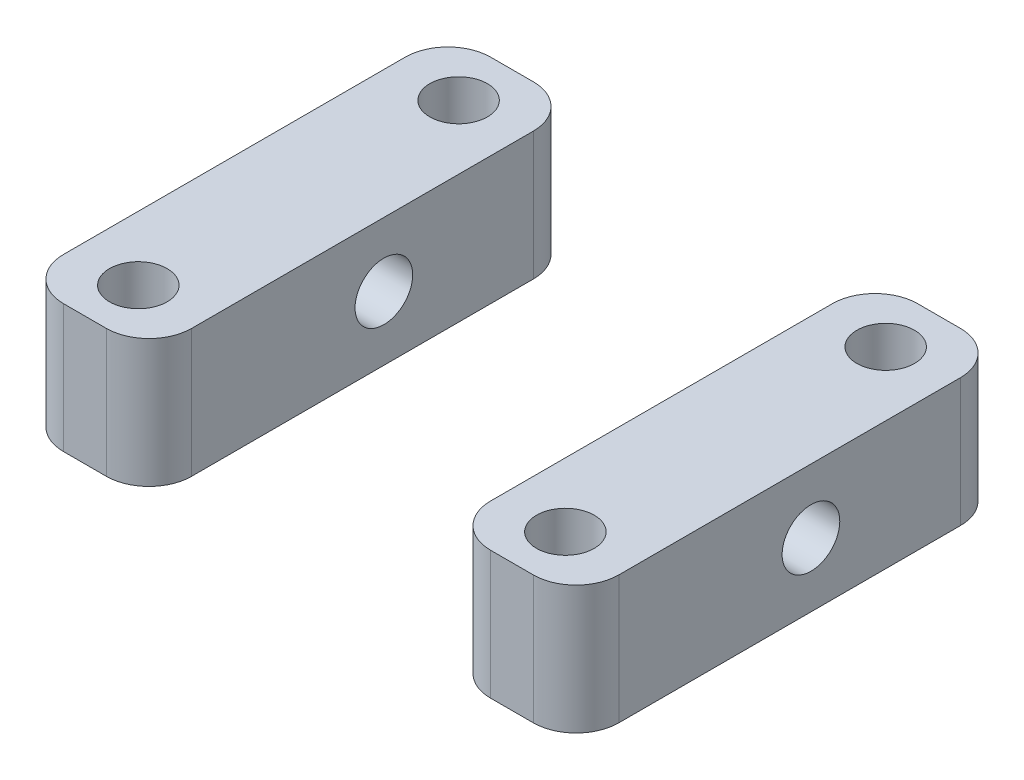
ISO-10303-21;
HEADER;
FILE_DESCRIPTION(('STEP AP214'),'2;1');
FILE_NAME('part.step','',(''),(''),'','','');
FILE_SCHEMA(('AUTOMOTIVE_DESIGN { 1 0 10303 214 1 1 1 1 }'));
ENDSEC;
DATA;
#1=APPLICATION_CONTEXT('core data for automotive mechanical design processes');
#2=APPLICATION_PROTOCOL_DEFINITION('international standard','automotive_design',2000,#1);
#3=PRODUCT_CONTEXT('',#1,'mechanical');
#4=PRODUCT('Part','Part','',(#3));
#5=PRODUCT_RELATED_PRODUCT_CATEGORY('part','',(#4));
#6=PRODUCT_DEFINITION_FORMATION('','',#4);
#7=PRODUCT_DEFINITION_CONTEXT('part definition',#1,'design');
#8=PRODUCT_DEFINITION('design','',#6,#7);
#9=PRODUCT_DEFINITION_SHAPE('','',#8);
#10=(LENGTH_UNIT() NAMED_UNIT(*) SI_UNIT(.MILLI.,.METRE.));
#11=(NAMED_UNIT(*) PLANE_ANGLE_UNIT() SI_UNIT($,.RADIAN.));
#12=(NAMED_UNIT(*) SI_UNIT($,.STERADIAN.) SOLID_ANGLE_UNIT());
#13=UNCERTAINTY_MEASURE_WITH_UNIT(LENGTH_MEASURE(1.E-05),#10,'distance_accuracy_value','');
#14=(GEOMETRIC_REPRESENTATION_CONTEXT(3) GLOBAL_UNCERTAINTY_ASSIGNED_CONTEXT((#13)) GLOBAL_UNIT_ASSIGNED_CONTEXT((#10,
#11,#12)) REPRESENTATION_CONTEXT('',''));
#15=CARTESIAN_POINT('',(0.,0.,0.));
#16=DIRECTION('',(0.,0.,1.));
#17=DIRECTION('',(1.,0.,0.));
#18=AXIS2_PLACEMENT_3D('',#15,#16,#17);
#19=CARTESIAN_POINT('',(0.,6.,0.));
#20=DIRECTION('',(0.,-1.,0.));
#21=DIRECTION('',(0.,0.,-1.));
#22=AXIS2_PLACEMENT_3D('',#19,#20,#21);
#23=PLANE('',#22);
#24=CARTESIAN_POINT('',(-10.,6.,7.5));
#25=DIRECTION('',(0.,1.,0.));
#26=DIRECTION('',(0.,0.,-1.));
#27=AXIS2_PLACEMENT_3D('',#24,#25,#26);
#28=CIRCLE('',#27,1.35);
#29=CARTESIAN_POINT('',(-10.,6.,6.15));
#30=VERTEX_POINT('',#29);
#31=EDGE_CURVE('E143',#30,#30,#28,.T.);
#32=ORIENTED_EDGE('',*,*,#31,.F.);
#33=EDGE_LOOP('',(#32));
#34=FACE_BOUND('',#33,.T.);
#35=CARTESIAN_POINT('',(-10.,6.,-7.5));
#36=DIRECTION('',(0.,1.,0.));
#37=DIRECTION('',(0.,0.,1.));
#38=AXIS2_PLACEMENT_3D('',#35,#36,#37);
#39=CIRCLE('',#38,1.35);
#40=CARTESIAN_POINT('',(-10.,6.,-6.15));
#41=VERTEX_POINT('',#40);
#42=EDGE_CURVE('E139',#41,#41,#39,.T.);
#43=ORIENTED_EDGE('',*,*,#42,.F.);
#44=EDGE_LOOP('',(#43));
#45=FACE_BOUND('',#44,.T.);
#46=DIRECTION('',(-1.,0.,0.));
#47=VECTOR('',#46,1.);
#48=CARTESIAN_POINT('',(-13.,6.,-10.));
#49=LINE('',#48,#47);
#50=CARTESIAN_POINT('',(-9.,6.,-10.));
#51=VERTEX_POINT('',#50);
#52=CARTESIAN_POINT('',(-11.,6.,-10.));
#53=VERTEX_POINT('',#52);
#54=EDGE_CURVE('E153',#51,#53,#49,.T.);
#55=ORIENTED_EDGE('',*,*,#54,.T.);
#56=CARTESIAN_POINT('',(-11.,6.,-8.));
#57=DIRECTION('',(0.,-1.,0.));
#58=DIRECTION('',(0.,0.,-1.));
#59=AXIS2_PLACEMENT_3D('',#56,#57,#58);
#60=CIRCLE('',#59,2.);
#61=CARTESIAN_POINT('',(-13.,6.,-8.));
#62=VERTEX_POINT('',#61);
#63=EDGE_CURVE('E185',#53,#62,#60,.F.);
#64=ORIENTED_EDGE('',*,*,#63,.T.);
#65=DIRECTION('',(0.,0.,1.));
#66=VECTOR('',#65,1.);
#67=CARTESIAN_POINT('',(-13.,6.,10.));
#68=LINE('',#67,#66);
#69=CARTESIAN_POINT('',(-13.,6.,8.));
#70=VERTEX_POINT('',#69);
#71=EDGE_CURVE('E132',#62,#70,#68,.T.);
#72=ORIENTED_EDGE('',*,*,#71,.T.);
#73=CARTESIAN_POINT('',(-11.,6.,8.));
#74=DIRECTION('',(0.,-1.,0.));
#75=DIRECTION('',(0.,0.,-1.));
#76=AXIS2_PLACEMENT_3D('',#73,#74,#75);
#77=CIRCLE('',#76,2.);
#78=CARTESIAN_POINT('',(-11.,6.,10.));
#79=VERTEX_POINT('',#78);
#80=EDGE_CURVE('E181',#70,#79,#77,.F.);
#81=ORIENTED_EDGE('',*,*,#80,.T.);
#82=DIRECTION('',(1.,0.,0.));
#83=VECTOR('',#82,1.);
#84=CARTESIAN_POINT('',(-13.,6.,10.));
#85=LINE('',#84,#83);
#86=CARTESIAN_POINT('',(-9.,6.,10.));
#87=VERTEX_POINT('',#86);
#88=EDGE_CURVE('E166',#79,#87,#85,.T.);
#89=ORIENTED_EDGE('',*,*,#88,.T.);
#90=CARTESIAN_POINT('',(-9.,6.,8.));
#91=DIRECTION('',(0.,-1.,0.));
#92=DIRECTION('',(0.,0.,-1.));
#93=AXIS2_PLACEMENT_3D('',#90,#91,#92);
#94=CIRCLE('',#93,2.);
#95=CARTESIAN_POINT('',(-7.,6.,8.));
#96=VERTEX_POINT('',#95);
#97=EDGE_CURVE('E60',#87,#96,#94,.F.);
#98=ORIENTED_EDGE('',*,*,#97,.T.);
#99=DIRECTION('',(0.,0.,1.));
#100=VECTOR('',#99,1.);
#101=CARTESIAN_POINT('',(-7.,6.,-10.));
#102=LINE('',#101,#100);
#103=CARTESIAN_POINT('',(-7.,6.,-8.));
#104=VERTEX_POINT('',#103);
#105=EDGE_CURVE('E162',#104,#96,#102,.T.);
#106=ORIENTED_EDGE('',*,*,#105,.F.);
#107=CARTESIAN_POINT('',(-9.,6.,-8.));
#108=DIRECTION('',(0.,-1.,0.));
#109=DIRECTION('',(0.,0.,-1.));
#110=AXIS2_PLACEMENT_3D('',#107,#108,#109);
#111=CIRCLE('',#110,2.);
#112=EDGE_CURVE('E68',#104,#51,#111,.F.);
#113=ORIENTED_EDGE('',*,*,#112,.T.);
#114=EDGE_LOOP('',(#55,#64,#72,#81,#89,#98,#106,#113));
#115=FACE_BOUND('',#114,.T.);
#116=ADVANCED_FACE('F45',(#34,#45,#115),#23,.F.);
#117=CARTESIAN_POINT('',(0.,0.,0.));
#118=DIRECTION('',(0.,-1.,0.));
#119=DIRECTION('',(0.,0.,-1.));
#120=AXIS2_PLACEMENT_3D('',#117,#118,#119);
#121=PLANE('',#120);
#122=DIRECTION('',(0.,0.,1.));
#123=VECTOR('',#122,1.);
#124=CARTESIAN_POINT('',(-13.,0.,10.));
#125=LINE('',#124,#123);
#126=CARTESIAN_POINT('',(-13.,0.,-8.));
#127=VERTEX_POINT('',#126);
#128=CARTESIAN_POINT('',(-13.,0.,8.));
#129=VERTEX_POINT('',#128);
#130=EDGE_CURVE('E129',#127,#129,#125,.T.);
#131=ORIENTED_EDGE('',*,*,#130,.F.);
#132=CARTESIAN_POINT('',(-11.,0.,-8.));
#133=DIRECTION('',(0.,-1.,0.));
#134=DIRECTION('',(0.,0.,-1.));
#135=AXIS2_PLACEMENT_3D('',#132,#133,#134);
#136=CIRCLE('',#135,2.);
#137=CARTESIAN_POINT('',(-11.,0.,-10.));
#138=VERTEX_POINT('',#137);
#139=EDGE_CURVE('E112',#127,#138,#136,.T.);
#140=ORIENTED_EDGE('',*,*,#139,.T.);
#141=DIRECTION('',(-1.,0.,0.));
#142=VECTOR('',#141,1.);
#143=CARTESIAN_POINT('',(-13.,0.,-10.));
#144=LINE('',#143,#142);
#145=CARTESIAN_POINT('',(-9.,0.,-10.));
#146=VERTEX_POINT('',#145);
#147=EDGE_CURVE('E146',#146,#138,#144,.T.);
#148=ORIENTED_EDGE('',*,*,#147,.F.);
#149=CARTESIAN_POINT('',(-9.,0.,-8.));
#150=DIRECTION('',(0.,-1.,0.));
#151=DIRECTION('',(0.,0.,-1.));
#152=AXIS2_PLACEMENT_3D('',#149,#150,#151);
#153=CIRCLE('',#152,2.);
#154=CARTESIAN_POINT('',(-7.,0.,-8.));
#155=VERTEX_POINT('',#154);
#156=EDGE_CURVE('E123',#146,#155,#153,.T.);
#157=ORIENTED_EDGE('',*,*,#156,.T.);
#158=DIRECTION('',(0.,0.,1.));
#159=VECTOR('',#158,1.);
#160=CARTESIAN_POINT('',(-7.,0.,-10.));
#161=LINE('',#160,#159);
#162=CARTESIAN_POINT('',(-7.,0.,8.));
#163=VERTEX_POINT('',#162);
#164=EDGE_CURVE('E152',#155,#163,#161,.T.);
#165=ORIENTED_EDGE('',*,*,#164,.T.);
#166=CARTESIAN_POINT('',(-9.,0.,8.));
#167=DIRECTION('',(0.,-1.,0.));
#168=DIRECTION('',(0.,0.,-1.));
#169=AXIS2_PLACEMENT_3D('',#166,#167,#168);
#170=CIRCLE('',#169,2.);
#171=CARTESIAN_POINT('',(-9.,0.,10.));
#172=VERTEX_POINT('',#171);
#173=EDGE_CURVE('E176',#163,#172,#170,.T.);
#174=ORIENTED_EDGE('',*,*,#173,.T.);
#175=DIRECTION('',(1.,0.,0.));
#176=VECTOR('',#175,1.);
#177=CARTESIAN_POINT('',(-13.,0.,10.));
#178=LINE('',#177,#176);
#179=CARTESIAN_POINT('',(-11.,0.,10.));
#180=VERTEX_POINT('',#179);
#181=EDGE_CURVE('E140',#180,#172,#178,.T.);
#182=ORIENTED_EDGE('',*,*,#181,.F.);
#183=CARTESIAN_POINT('',(-11.,0.,8.));
#184=DIRECTION('',(0.,-1.,0.));
#185=DIRECTION('',(0.,0.,-1.));
#186=AXIS2_PLACEMENT_3D('',#183,#184,#185);
#187=CIRCLE('',#186,2.);
#188=EDGE_CURVE('E133',#180,#129,#187,.T.);
#189=ORIENTED_EDGE('',*,*,#188,.T.);
#190=EDGE_LOOP('',(#131,#140,#148,#157,#165,#174,#182,#189));
#191=FACE_BOUND('',#190,.T.);
#192=CARTESIAN_POINT('',(-10.,0.,7.5));
#193=DIRECTION('',(0.,1.,0.));
#194=DIRECTION('',(0.,0.,-1.));
#195=AXIS2_PLACEMENT_3D('',#192,#193,#194);
#196=CIRCLE('',#195,1.35);
#197=CARTESIAN_POINT('',(-10.,0.,6.15));
#198=VERTEX_POINT('',#197);
#199=EDGE_CURVE('E156',#198,#198,#196,.T.);
#200=ORIENTED_EDGE('',*,*,#199,.T.);
#201=EDGE_LOOP('',(#200));
#202=FACE_BOUND('',#201,.T.);
#203=CARTESIAN_POINT('',(-10.,0.,-7.5));
#204=DIRECTION('',(0.,1.,0.));
#205=DIRECTION('',(0.,0.,1.));
#206=AXIS2_PLACEMENT_3D('',#203,#204,#205);
#207=CIRCLE('',#206,1.35);
#208=CARTESIAN_POINT('',(-10.,0.,-6.15));
#209=VERTEX_POINT('',#208);
#210=EDGE_CURVE('E154',#209,#209,#207,.T.);
#211=ORIENTED_EDGE('',*,*,#210,.T.);
#212=EDGE_LOOP('',(#211));
#213=FACE_BOUND('',#212,.T.);
#214=ADVANCED_FACE('F136',(#191,#202,#213),#121,.T.);
#215=CARTESIAN_POINT('',(-13.,6.,-10.));
#216=DIRECTION('',(0.,0.,1.));
#217=DIRECTION('',(1.,0.,0.));
#218=AXIS2_PLACEMENT_3D('',#215,#216,#217);
#219=PLANE('',#218);
#220=ORIENTED_EDGE('',*,*,#147,.T.);
#221=DIRECTION('',(0.,-1.,0.));
#222=VECTOR('',#221,1.);
#223=CARTESIAN_POINT('',(-11.,6.,-10.));
#224=LINE('',#223,#222);
#225=EDGE_CURVE('E117',#138,#53,#224,.F.);
#226=ORIENTED_EDGE('',*,*,#225,.T.);
#227=ORIENTED_EDGE('',*,*,#54,.F.);
#228=DIRECTION('',(0.,1.,0.));
#229=VECTOR('',#228,1.);
#230=CARTESIAN_POINT('',(-9.,6.,-10.));
#231=LINE('',#230,#229);
#232=EDGE_CURVE('E122',#51,#146,#231,.F.);
#233=ORIENTED_EDGE('',*,*,#232,.T.);
#234=EDGE_LOOP('',(#220,#226,#227,#233));
#235=FACE_BOUND('',#234,.T.);
#236=ADVANCED_FACE('F214',(#235),#219,.F.);
#237=CARTESIAN_POINT('',(-13.,6.,10.));
#238=DIRECTION('',(0.,0.,-1.));
#239=DIRECTION('',(-1.,0.,0.));
#240=AXIS2_PLACEMENT_3D('',#237,#238,#239);
#241=PLANE('',#240);
#242=ORIENTED_EDGE('',*,*,#181,.T.);
#243=DIRECTION('',(0.,1.,0.));
#244=VECTOR('',#243,1.);
#245=CARTESIAN_POINT('',(-9.,6.,10.));
#246=LINE('',#245,#244);
#247=EDGE_CURVE('E12',#172,#87,#246,.T.);
#248=ORIENTED_EDGE('',*,*,#247,.T.);
#249=ORIENTED_EDGE('',*,*,#88,.F.);
#250=DIRECTION('',(0.,-1.,0.));
#251=VECTOR('',#250,1.);
#252=CARTESIAN_POINT('',(-11.,6.,10.));
#253=LINE('',#252,#251);
#254=EDGE_CURVE('E53',#79,#180,#253,.T.);
#255=ORIENTED_EDGE('',*,*,#254,.T.);
#256=EDGE_LOOP('',(#242,#248,#249,#255));
#257=FACE_BOUND('',#256,.T.);
#258=ADVANCED_FACE('F194',(#257),#241,.F.);
#259=CARTESIAN_POINT('',(-13.,6.,10.));
#260=DIRECTION('',(1.,0.,0.));
#261=DIRECTION('',(0.,0.,-1.));
#262=AXIS2_PLACEMENT_3D('',#259,#260,#261);
#263=PLANE('',#262);
#264=CARTESIAN_POINT('',(-13.,3.,-1.));
#265=DIRECTION('',(1.,0.,0.));
#266=DIRECTION('',(0.,0.,-1.));
#267=AXIS2_PLACEMENT_3D('',#264,#265,#266);
#268=CIRCLE('',#267,1.35);
#269=CARTESIAN_POINT('',(-13.,3.,-2.35));
#270=VERTEX_POINT('',#269);
#271=EDGE_CURVE('E150',#270,#270,#268,.T.);
#272=ORIENTED_EDGE('',*,*,#271,.T.);
#273=EDGE_LOOP('',(#272));
#274=FACE_BOUND('',#273,.T.);
#275=ORIENTED_EDGE('',*,*,#71,.F.);
#276=DIRECTION('',(0.,-1.,0.));
#277=VECTOR('',#276,1.);
#278=CARTESIAN_POINT('',(-13.,6.,-8.));
#279=LINE('',#278,#277);
#280=EDGE_CURVE('E116',#62,#127,#279,.T.);
#281=ORIENTED_EDGE('',*,*,#280,.T.);
#282=ORIENTED_EDGE('',*,*,#130,.T.);
#283=DIRECTION('',(0.,-1.,0.));
#284=VECTOR('',#283,1.);
#285=CARTESIAN_POINT('',(-13.,6.,8.));
#286=LINE('',#285,#284);
#287=EDGE_CURVE('E134',#129,#70,#286,.F.);
#288=ORIENTED_EDGE('',*,*,#287,.T.);
#289=EDGE_LOOP('',(#275,#281,#282,#288));
#290=FACE_BOUND('',#289,.T.);
#291=ADVANCED_FACE('F128',(#274,#290),#263,.F.);
#292=CARTESIAN_POINT('',(-10.,6.,-7.5));
#293=DIRECTION('',(0.,-1.,0.));
#294=DIRECTION('',(0.,0.,-1.));
#295=AXIS2_PLACEMENT_3D('',#292,#293,#294);
#296=CYLINDRICAL_SURFACE('',#295,1.35);
#297=ORIENTED_EDGE('',*,*,#42,.T.);
#298=EDGE_LOOP('',(#297));
#299=FACE_BOUND('',#298,.T.);
#300=ORIENTED_EDGE('',*,*,#210,.F.);
#301=EDGE_LOOP('',(#300));
#302=FACE_BOUND('',#301,.T.);
#303=ADVANCED_FACE('F243',(#299,#302),#296,.F.);
#304=CARTESIAN_POINT('',(-10.,6.,7.5));
#305=DIRECTION('',(0.,-1.,0.));
#306=DIRECTION('',(0.,0.,-1.));
#307=AXIS2_PLACEMENT_3D('',#304,#305,#306);
#308=CYLINDRICAL_SURFACE('',#307,1.35);
#309=ORIENTED_EDGE('',*,*,#31,.T.);
#310=EDGE_LOOP('',(#309));
#311=FACE_BOUND('',#310,.T.);
#312=ORIENTED_EDGE('',*,*,#199,.F.);
#313=EDGE_LOOP('',(#312));
#314=FACE_BOUND('',#313,.T.);
#315=ADVANCED_FACE('F239',(#311,#314),#308,.F.);
#316=CARTESIAN_POINT('',(-7.,0.,-10.));
#317=DIRECTION('',(-1.,0.,0.));
#318=DIRECTION('',(0.,0.,1.));
#319=AXIS2_PLACEMENT_3D('',#316,#317,#318);
#320=PLANE('',#319);
#321=CARTESIAN_POINT('',(-7.,3.,-1.));
#322=DIRECTION('',(-1.,0.,0.));
#323=DIRECTION('',(0.,0.,1.));
#324=AXIS2_PLACEMENT_3D('',#321,#322,#323);
#325=CIRCLE('',#324,1.35);
#326=CARTESIAN_POINT('',(-7.,3.,0.35));
#327=VERTEX_POINT('',#326);
#328=EDGE_CURVE('E168',#327,#327,#325,.T.);
#329=ORIENTED_EDGE('',*,*,#328,.T.);
#330=EDGE_LOOP('',(#329));
#331=FACE_BOUND('',#330,.T.);
#332=ORIENTED_EDGE('',*,*,#164,.F.);
#333=DIRECTION('',(0.,1.,0.));
#334=VECTOR('',#333,1.);
#335=CARTESIAN_POINT('',(-7.,0.,-8.));
#336=LINE('',#335,#334);
#337=EDGE_CURVE('E189',#155,#104,#336,.T.);
#338=ORIENTED_EDGE('',*,*,#337,.T.);
#339=ORIENTED_EDGE('',*,*,#105,.T.);
#340=DIRECTION('',(0.,1.,0.));
#341=VECTOR('',#340,1.);
#342=CARTESIAN_POINT('',(-7.,0.,8.));
#343=LINE('',#342,#341);
#344=EDGE_CURVE('E187',#96,#163,#343,.F.);
#345=ORIENTED_EDGE('',*,*,#344,.T.);
#346=EDGE_LOOP('',(#332,#338,#339,#345));
#347=FACE_BOUND('',#346,.T.);
#348=ADVANCED_FACE('F228',(#331,#347),#320,.F.);
#349=CARTESIAN_POINT('',(-13.,3.,-1.));
#350=DIRECTION('',(1.,0.,0.));
#351=DIRECTION('',(0.,0.,-1.));
#352=AXIS2_PLACEMENT_3D('',#349,#350,#351);
#353=CYLINDRICAL_SURFACE('',#352,1.35);
#354=ORIENTED_EDGE('',*,*,#271,.F.);
#355=EDGE_LOOP('',(#354));
#356=FACE_BOUND('',#355,.T.);
#357=ORIENTED_EDGE('',*,*,#328,.F.);
#358=EDGE_LOOP('',(#357));
#359=FACE_BOUND('',#358,.T.);
#360=ADVANCED_FACE('F222',(#356,#359),#353,.F.);
#361=CARTESIAN_POINT('',(-11.,6.,-8.));
#362=DIRECTION('',(0.,-1.,0.));
#363=DIRECTION('',(0.,0.,-1.));
#364=AXIS2_PLACEMENT_3D('',#361,#362,#363);
#365=CYLINDRICAL_SURFACE('',#364,2.);
#366=ORIENTED_EDGE('',*,*,#63,.F.);
#367=ORIENTED_EDGE('',*,*,#225,.F.);
#368=ORIENTED_EDGE('',*,*,#139,.F.);
#369=ORIENTED_EDGE('',*,*,#280,.F.);
#370=EDGE_LOOP('',(#366,#367,#368,#369));
#371=FACE_BOUND('',#370,.T.);
#372=ADVANCED_FACE('F115',(#371),#365,.T.);
#373=CARTESIAN_POINT('',(-9.,0.,-8.));
#374=DIRECTION('',(0.,1.,0.));
#375=DIRECTION('',(0.,0.,1.));
#376=AXIS2_PLACEMENT_3D('',#373,#374,#375);
#377=CYLINDRICAL_SURFACE('',#376,2.);
#378=ORIENTED_EDGE('',*,*,#156,.F.);
#379=ORIENTED_EDGE('',*,*,#232,.F.);
#380=ORIENTED_EDGE('',*,*,#112,.F.);
#381=ORIENTED_EDGE('',*,*,#337,.F.);
#382=EDGE_LOOP('',(#378,#379,#380,#381));
#383=FACE_BOUND('',#382,.T.);
#384=ADVANCED_FACE('F207',(#383),#377,.T.);
#385=CARTESIAN_POINT('',(-9.,6.,8.));
#386=DIRECTION('',(0.,1.,0.));
#387=DIRECTION('',(0.,0.,1.));
#388=AXIS2_PLACEMENT_3D('',#385,#386,#387);
#389=CYLINDRICAL_SURFACE('',#388,2.);
#390=ORIENTED_EDGE('',*,*,#173,.F.);
#391=ORIENTED_EDGE('',*,*,#344,.F.);
#392=ORIENTED_EDGE('',*,*,#97,.F.);
#393=ORIENTED_EDGE('',*,*,#247,.F.);
#394=EDGE_LOOP('',(#390,#391,#392,#393));
#395=FACE_BOUND('',#394,.T.);
#396=ADVANCED_FACE('F202',(#395),#389,.T.);
#397=CARTESIAN_POINT('',(-11.,6.,8.));
#398=DIRECTION('',(0.,-1.,0.));
#399=DIRECTION('',(0.,0.,-1.));
#400=AXIS2_PLACEMENT_3D('',#397,#398,#399);
#401=CYLINDRICAL_SURFACE('',#400,2.);
#402=ORIENTED_EDGE('',*,*,#80,.F.);
#403=ORIENTED_EDGE('',*,*,#287,.F.);
#404=ORIENTED_EDGE('',*,*,#188,.F.);
#405=ORIENTED_EDGE('',*,*,#254,.F.);
#406=EDGE_LOOP('',(#402,#403,#404,#405));
#407=FACE_BOUND('',#406,.T.);
#408=ADVANCED_FACE('F47',(#407),#401,.T.);
#409=CLOSED_SHELL('',(#116,#214,#236,#258,#291,#303,#315,#348,#360,#372,#384,#396,#408));
#410=MANIFOLD_SOLID_BREP('B2',#409);
#411=CARTESIAN_POINT('',(10.,6.,-7.5));
#412=DIRECTION('',(0.,-1.,0.));
#413=DIRECTION('',(0.,0.,-1.));
#414=AXIS2_PLACEMENT_3D('',#411,#412,#413);
#415=CYLINDRICAL_SURFACE('',#414,1.35);
#416=CARTESIAN_POINT('',(10.,6.,-7.5));
#417=DIRECTION('',(0.,1.,0.));
#418=DIRECTION('',(0.,0.,-1.));
#419=AXIS2_PLACEMENT_3D('',#416,#417,#418);
#420=CIRCLE('',#419,1.35);
#421=CARTESIAN_POINT('',(10.,6.,-8.85));
#422=VERTEX_POINT('',#421);
#423=EDGE_CURVE('E430',#422,#422,#420,.T.);
#424=ORIENTED_EDGE('',*,*,#423,.T.);
#425=EDGE_LOOP('',(#424));
#426=FACE_BOUND('',#425,.T.);
#427=CARTESIAN_POINT('',(10.,0.,-7.5));
#428=DIRECTION('',(0.,1.,0.));
#429=DIRECTION('',(0.,0.,-1.));
#430=AXIS2_PLACEMENT_3D('',#427,#428,#429);
#431=CIRCLE('',#430,1.35);
#432=CARTESIAN_POINT('',(10.,0.,-8.85));
#433=VERTEX_POINT('',#432);
#434=EDGE_CURVE('E436',#433,#433,#431,.T.);
#435=ORIENTED_EDGE('',*,*,#434,.F.);
#436=EDGE_LOOP('',(#435));
#437=FACE_BOUND('',#436,.T.);
#438=ADVANCED_FACE('F336',(#426,#437),#415,.F.);
#439=CARTESIAN_POINT('',(10.,6.,7.5));
#440=DIRECTION('',(0.,-1.,0.));
#441=DIRECTION('',(0.,0.,-1.));
#442=AXIS2_PLACEMENT_3D('',#439,#440,#441);
#443=CYLINDRICAL_SURFACE('',#442,1.35);
#444=CARTESIAN_POINT('',(10.,6.,7.5));
#445=DIRECTION('',(0.,1.,0.));
#446=DIRECTION('',(0.,0.,1.));
#447=AXIS2_PLACEMENT_3D('',#444,#445,#446);
#448=CIRCLE('',#447,1.35);
#449=CARTESIAN_POINT('',(10.,6.,8.85));
#450=VERTEX_POINT('',#449);
#451=EDGE_CURVE('E482',#450,#450,#448,.T.);
#452=ORIENTED_EDGE('',*,*,#451,.T.);
#453=EDGE_LOOP('',(#452));
#454=FACE_BOUND('',#453,.T.);
#455=CARTESIAN_POINT('',(10.,0.,7.5));
#456=DIRECTION('',(0.,1.,0.));
#457=DIRECTION('',(0.,0.,1.));
#458=AXIS2_PLACEMENT_3D('',#455,#456,#457);
#459=CIRCLE('',#458,1.35);
#460=CARTESIAN_POINT('',(10.,0.,8.85));
#461=VERTEX_POINT('',#460);
#462=EDGE_CURVE('E478',#461,#461,#459,.T.);
#463=ORIENTED_EDGE('',*,*,#462,.F.);
#464=EDGE_LOOP('',(#463));
#465=FACE_BOUND('',#464,.T.);
#466=ADVANCED_FACE('F512',(#454,#465),#443,.F.);
#467=CARTESIAN_POINT('',(13.,6.,10.));
#468=DIRECTION('',(-1.,0.,0.));
#469=DIRECTION('',(0.,0.,1.));
#470=AXIS2_PLACEMENT_3D('',#467,#468,#469);
#471=PLANE('',#470);
#472=CARTESIAN_POINT('',(13.,3.,-1.));
#473=DIRECTION('',(1.,0.,0.));
#474=DIRECTION('',(0.,0.,-1.));
#475=AXIS2_PLACEMENT_3D('',#472,#473,#474);
#476=CIRCLE('',#475,1.35);
#477=CARTESIAN_POINT('',(13.,3.,-2.35));
#478=VERTEX_POINT('',#477);
#479=EDGE_CURVE('E447',#478,#478,#476,.T.);
#480=ORIENTED_EDGE('',*,*,#479,.F.);
#481=EDGE_LOOP('',(#480));
#482=FACE_BOUND('',#481,.T.);
#483=DIRECTION('',(0.,0.,-1.));
#484=VECTOR('',#483,1.);
#485=CARTESIAN_POINT('',(13.,6.,10.));
#486=LINE('',#485,#484);
#487=CARTESIAN_POINT('',(13.,6.,8.));
#488=VERTEX_POINT('',#487);
#489=CARTESIAN_POINT('',(13.,6.,-8.));
#490=VERTEX_POINT('',#489);
#491=EDGE_CURVE('E422',#488,#490,#486,.T.);
#492=ORIENTED_EDGE('',*,*,#491,.F.);
#493=DIRECTION('',(0.,-1.,0.));
#494=VECTOR('',#493,1.);
#495=CARTESIAN_POINT('',(13.,6.,8.));
#496=LINE('',#495,#494);
#497=CARTESIAN_POINT('',(13.,0.,8.));
#498=VERTEX_POINT('',#497);
#499=EDGE_CURVE('E406',#488,#498,#496,.T.);
#500=ORIENTED_EDGE('',*,*,#499,.T.);
#501=DIRECTION('',(0.,0.,-1.));
#502=VECTOR('',#501,1.);
#503=CARTESIAN_POINT('',(13.,0.,10.));
#504=LINE('',#503,#502);
#505=CARTESIAN_POINT('',(13.,0.,-8.));
#506=VERTEX_POINT('',#505);
#507=EDGE_CURVE('E419',#498,#506,#504,.T.);
#508=ORIENTED_EDGE('',*,*,#507,.T.);
#509=DIRECTION('',(0.,-1.,0.));
#510=VECTOR('',#509,1.);
#511=CARTESIAN_POINT('',(13.,6.,-8.));
#512=LINE('',#511,#510);
#513=EDGE_CURVE('E424',#506,#490,#512,.F.);
#514=ORIENTED_EDGE('',*,*,#513,.T.);
#515=EDGE_LOOP('',(#492,#500,#508,#514));
#516=FACE_BOUND('',#515,.T.);
#517=ADVANCED_FACE('F418',(#482,#516),#471,.F.);
#518=CARTESIAN_POINT('',(-13.,6.,10.));
#519=DIRECTION('',(0.,0.,-1.));
#520=DIRECTION('',(-1.,0.,0.));
#521=AXIS2_PLACEMENT_3D('',#518,#519,#520);
#522=PLANE('',#521);
#523=DIRECTION('',(1.,0.,0.));
#524=VECTOR('',#523,1.);
#525=CARTESIAN_POINT('',(-13.,0.,10.));
#526=LINE('',#525,#524);
#527=CARTESIAN_POINT('',(8.99999999999999,0.,10.));
#528=VERTEX_POINT('',#527);
#529=CARTESIAN_POINT('',(11.,0.,10.));
#530=VERTEX_POINT('',#529);
#531=EDGE_CURVE('E433',#528,#530,#526,.T.);
#532=ORIENTED_EDGE('',*,*,#531,.T.);
#533=DIRECTION('',(0.,-1.,0.));
#534=VECTOR('',#533,1.);
#535=CARTESIAN_POINT('',(11.,6.,10.));
#536=LINE('',#535,#534);
#537=CARTESIAN_POINT('',(11.,6.,10.));
#538=VERTEX_POINT('',#537);
#539=EDGE_CURVE('E407',#530,#538,#536,.F.);
#540=ORIENTED_EDGE('',*,*,#539,.T.);
#541=DIRECTION('',(1.,0.,0.));
#542=VECTOR('',#541,1.);
#543=CARTESIAN_POINT('',(-13.,6.,10.));
#544=LINE('',#543,#542);
#545=CARTESIAN_POINT('',(8.99999999999999,6.,10.));
#546=VERTEX_POINT('',#545);
#547=EDGE_CURVE('E439',#546,#538,#544,.T.);
#548=ORIENTED_EDGE('',*,*,#547,.F.);
#549=DIRECTION('',(0.,1.,0.));
#550=VECTOR('',#549,1.);
#551=CARTESIAN_POINT('',(9.,6.,10.));
#552=LINE('',#551,#550);
#553=EDGE_CURVE('E412',#546,#528,#552,.F.);
#554=ORIENTED_EDGE('',*,*,#553,.T.);
#555=EDGE_LOOP('',(#532,#540,#548,#554));
#556=FACE_BOUND('',#555,.T.);
#557=ADVANCED_FACE('F492',(#556),#522,.F.);
#558=CARTESIAN_POINT('',(-13.,6.,-10.));
#559=DIRECTION('',(0.,0.,1.));
#560=DIRECTION('',(1.,0.,0.));
#561=AXIS2_PLACEMENT_3D('',#558,#559,#560);
#562=PLANE('',#561);
#563=DIRECTION('',(-1.,0.,0.));
#564=VECTOR('',#563,1.);
#565=CARTESIAN_POINT('',(-13.,6.,-10.));
#566=LINE('',#565,#564);
#567=CARTESIAN_POINT('',(11.,6.,-10.));
#568=VERTEX_POINT('',#567);
#569=CARTESIAN_POINT('',(9.,6.,-10.));
#570=VERTEX_POINT('',#569);
#571=EDGE_CURVE('E489',#568,#570,#566,.T.);
#572=ORIENTED_EDGE('',*,*,#571,.F.);
#573=DIRECTION('',(0.,-1.,0.));
#574=VECTOR('',#573,1.);
#575=CARTESIAN_POINT('',(11.,6.,-10.));
#576=LINE('',#575,#574);
#577=CARTESIAN_POINT('',(11.,0.,-10.));
#578=VERTEX_POINT('',#577);
#579=EDGE_CURVE('E464',#568,#578,#576,.T.);
#580=ORIENTED_EDGE('',*,*,#579,.T.);
#581=DIRECTION('',(-1.,0.,0.));
#582=VECTOR('',#581,1.);
#583=CARTESIAN_POINT('',(-13.,0.,-10.));
#584=LINE('',#583,#582);
#585=CARTESIAN_POINT('',(9.,0.,-10.));
#586=VERTEX_POINT('',#585);
#587=EDGE_CURVE('E429',#578,#586,#584,.T.);
#588=ORIENTED_EDGE('',*,*,#587,.T.);
#589=DIRECTION('',(0.,1.,0.));
#590=VECTOR('',#589,1.);
#591=CARTESIAN_POINT('',(9.,6.,-10.));
#592=LINE('',#591,#590);
#593=EDGE_CURVE('E461',#586,#570,#592,.T.);
#594=ORIENTED_EDGE('',*,*,#593,.T.);
#595=EDGE_LOOP('',(#572,#580,#588,#594));
#596=FACE_BOUND('',#595,.T.);
#597=ADVANCED_FACE('F498',(#596),#562,.F.);
#598=CARTESIAN_POINT('',(0.,0.,0.));
#599=DIRECTION('',(0.,-1.,0.));
#600=DIRECTION('',(0.,0.,-1.));
#601=AXIS2_PLACEMENT_3D('',#598,#599,#600);
#602=PLANE('',#601);
#603=ORIENTED_EDGE('',*,*,#507,.F.);
#604=CARTESIAN_POINT('',(11.,0.,8.));
#605=DIRECTION('',(0.,-1.,0.));
#606=DIRECTION('',(0.,0.,-1.));
#607=AXIS2_PLACEMENT_3D('',#604,#605,#606);
#608=CIRCLE('',#607,2.);
#609=EDGE_CURVE('E402',#498,#530,#608,.T.);
#610=ORIENTED_EDGE('',*,*,#609,.T.);
#611=ORIENTED_EDGE('',*,*,#531,.F.);
#612=CARTESIAN_POINT('',(9.,0.,8.));
#613=DIRECTION('',(0.,-1.,0.));
#614=DIRECTION('',(0.,0.,-1.));
#615=AXIS2_PLACEMENT_3D('',#612,#613,#614);
#616=CIRCLE('',#615,2.);
#617=CARTESIAN_POINT('',(7.,0.,8.));
#618=VERTEX_POINT('',#617);
#619=EDGE_CURVE('E423',#528,#618,#616,.T.);
#620=ORIENTED_EDGE('',*,*,#619,.T.);
#621=DIRECTION('',(0.,0.,-1.));
#622=VECTOR('',#621,1.);
#623=CARTESIAN_POINT('',(7.,0.,-10.));
#624=LINE('',#623,#622);
#625=CARTESIAN_POINT('',(7.,0.,-8.));
#626=VERTEX_POINT('',#625);
#627=EDGE_CURVE('E471',#618,#626,#624,.T.);
#628=ORIENTED_EDGE('',*,*,#627,.T.);
#629=CARTESIAN_POINT('',(9.,0.,-8.));
#630=DIRECTION('',(0.,-1.,0.));
#631=DIRECTION('',(0.,0.,-1.));
#632=AXIS2_PLACEMENT_3D('',#629,#630,#631);
#633=CIRCLE('',#632,2.);
#634=EDGE_CURVE('E450',#626,#586,#633,.T.);
#635=ORIENTED_EDGE('',*,*,#634,.T.);
#636=ORIENTED_EDGE('',*,*,#587,.F.);
#637=CARTESIAN_POINT('',(11.,0.,-8.));
#638=DIRECTION('',(0.,-1.,0.));
#639=DIRECTION('',(0.,0.,-1.));
#640=AXIS2_PLACEMENT_3D('',#637,#638,#639);
#641=CIRCLE('',#640,2.);
#642=EDGE_CURVE('E413',#578,#506,#641,.T.);
#643=ORIENTED_EDGE('',*,*,#642,.T.);
#644=EDGE_LOOP('',(#603,#610,#611,#620,#628,#635,#636,#643));
#645=FACE_BOUND('',#644,.T.);
#646=ORIENTED_EDGE('',*,*,#462,.T.);
#647=EDGE_LOOP('',(#646));
#648=FACE_BOUND('',#647,.T.);
#649=ORIENTED_EDGE('',*,*,#434,.T.);
#650=EDGE_LOOP('',(#649));
#651=FACE_BOUND('',#650,.T.);
#652=ADVANCED_FACE('F426',(#645,#648,#651),#602,.T.);
#653=CARTESIAN_POINT('',(0.,6.,0.));
#654=DIRECTION('',(0.,-1.,0.));
#655=DIRECTION('',(0.,0.,-1.));
#656=AXIS2_PLACEMENT_3D('',#653,#654,#655);
#657=PLANE('',#656);
#658=ORIENTED_EDGE('',*,*,#547,.T.);
#659=CARTESIAN_POINT('',(11.,6.,8.));
#660=DIRECTION('',(0.,-1.,0.));
#661=DIRECTION('',(0.,0.,-1.));
#662=AXIS2_PLACEMENT_3D('',#659,#660,#661);
#663=CIRCLE('',#662,2.);
#664=EDGE_CURVE('E459',#538,#488,#663,.F.);
#665=ORIENTED_EDGE('',*,*,#664,.T.);
#666=ORIENTED_EDGE('',*,*,#491,.T.);
#667=CARTESIAN_POINT('',(11.,6.,-8.));
#668=DIRECTION('',(0.,-1.,0.));
#669=DIRECTION('',(0.,0.,-1.));
#670=AXIS2_PLACEMENT_3D('',#667,#668,#669);
#671=CIRCLE('',#670,2.);
#672=EDGE_CURVE('E457',#490,#568,#671,.F.);
#673=ORIENTED_EDGE('',*,*,#672,.T.);
#674=ORIENTED_EDGE('',*,*,#571,.T.);
#675=CARTESIAN_POINT('',(9.,6.,-8.));
#676=DIRECTION('',(0.,-1.,0.));
#677=DIRECTION('',(0.,0.,-1.));
#678=AXIS2_PLACEMENT_3D('',#675,#676,#677);
#679=CIRCLE('',#678,2.);
#680=CARTESIAN_POINT('',(7.,6.,-8.));
#681=VERTEX_POINT('',#680);
#682=EDGE_CURVE('E351',#570,#681,#679,.F.);
#683=ORIENTED_EDGE('',*,*,#682,.T.);
#684=DIRECTION('',(0.,0.,-1.));
#685=VECTOR('',#684,1.);
#686=CARTESIAN_POINT('',(7.,6.,-10.));
#687=LINE('',#686,#685);
#688=CARTESIAN_POINT('',(7.,6.,8.));
#689=VERTEX_POINT('',#688);
#690=EDGE_CURVE('E446',#689,#681,#687,.T.);
#691=ORIENTED_EDGE('',*,*,#690,.F.);
#692=CARTESIAN_POINT('',(9.,6.,8.));
#693=DIRECTION('',(0.,-1.,0.));
#694=DIRECTION('',(0.,0.,-1.));
#695=AXIS2_PLACEMENT_3D('',#692,#693,#694);
#696=CIRCLE('',#695,2.);
#697=EDGE_CURVE('E359',#689,#546,#696,.F.);
#698=ORIENTED_EDGE('',*,*,#697,.T.);
#699=EDGE_LOOP('',(#658,#665,#666,#673,#674,#683,#691,#698));
#700=FACE_BOUND('',#699,.T.);
#701=ORIENTED_EDGE('',*,*,#423,.F.);
#702=EDGE_LOOP('',(#701));
#703=FACE_BOUND('',#702,.T.);
#704=ORIENTED_EDGE('',*,*,#451,.F.);
#705=EDGE_LOOP('',(#704));
#706=FACE_BOUND('',#705,.T.);
#707=ADVANCED_FACE('F474',(#700,#703,#706),#657,.F.);
#708=CARTESIAN_POINT('',(7.,0.,-10.));
#709=DIRECTION('',(1.,0.,0.));
#710=DIRECTION('',(0.,0.,-1.));
#711=AXIS2_PLACEMENT_3D('',#708,#709,#710);
#712=PLANE('',#711);
#713=CARTESIAN_POINT('',(7.,3.,-1.));
#714=DIRECTION('',(1.,0.,0.));
#715=DIRECTION('',(0.,0.,-1.));
#716=AXIS2_PLACEMENT_3D('',#713,#714,#715);
#717=CIRCLE('',#716,1.35);
#718=CARTESIAN_POINT('',(7.,3.,-2.35));
#719=VERTEX_POINT('',#718);
#720=EDGE_CURVE('E443',#719,#719,#717,.T.);
#721=ORIENTED_EDGE('',*,*,#720,.T.);
#722=EDGE_LOOP('',(#721));
#723=FACE_BOUND('',#722,.T.);
#724=ORIENTED_EDGE('',*,*,#690,.T.);
#725=DIRECTION('',(0.,1.,0.));
#726=VECTOR('',#725,1.);
#727=CARTESIAN_POINT('',(7.,0.,-8.));
#728=LINE('',#727,#726);
#729=EDGE_CURVE('E43',#681,#626,#728,.F.);
#730=ORIENTED_EDGE('',*,*,#729,.T.);
#731=ORIENTED_EDGE('',*,*,#627,.F.);
#732=DIRECTION('',(0.,1.,0.));
#733=VECTOR('',#732,1.);
#734=CARTESIAN_POINT('',(7.,0.,8.));
#735=LINE('',#734,#733);
#736=EDGE_CURVE('E344',#618,#689,#735,.T.);
#737=ORIENTED_EDGE('',*,*,#736,.T.);
#738=EDGE_LOOP('',(#724,#730,#731,#737));
#739=FACE_BOUND('',#738,.T.);
#740=ADVANCED_FACE('F468',(#723,#739),#712,.F.);
#741=CARTESIAN_POINT('',(-13.,3.,-1.));
#742=DIRECTION('',(1.,0.,0.));
#743=DIRECTION('',(0.,0.,-1.));
#744=AXIS2_PLACEMENT_3D('',#741,#742,#743);
#745=CYLINDRICAL_SURFACE('',#744,1.35);
#746=ORIENTED_EDGE('',*,*,#479,.T.);
#747=EDGE_LOOP('',(#746));
#748=FACE_BOUND('',#747,.T.);
#749=ORIENTED_EDGE('',*,*,#720,.F.);
#750=EDGE_LOOP('',(#749));
#751=FACE_BOUND('',#750,.T.);
#752=ADVANCED_FACE('F509',(#748,#751),#745,.F.);
#753=CARTESIAN_POINT('',(11.,6.,8.));
#754=DIRECTION('',(0.,-1.,0.));
#755=DIRECTION('',(0.,0.,-1.));
#756=AXIS2_PLACEMENT_3D('',#753,#754,#755);
#757=CYLINDRICAL_SURFACE('',#756,2.);
#758=ORIENTED_EDGE('',*,*,#664,.F.);
#759=ORIENTED_EDGE('',*,*,#539,.F.);
#760=ORIENTED_EDGE('',*,*,#609,.F.);
#761=ORIENTED_EDGE('',*,*,#499,.F.);
#762=EDGE_LOOP('',(#758,#759,#760,#761));
#763=FACE_BOUND('',#762,.T.);
#764=ADVANCED_FACE('F405',(#763),#757,.T.);
#765=CARTESIAN_POINT('',(11.,6.,-8.));
#766=DIRECTION('',(0.,-1.,0.));
#767=DIRECTION('',(0.,0.,-1.));
#768=AXIS2_PLACEMENT_3D('',#765,#766,#767);
#769=CYLINDRICAL_SURFACE('',#768,2.);
#770=ORIENTED_EDGE('',*,*,#672,.F.);
#771=ORIENTED_EDGE('',*,*,#513,.F.);
#772=ORIENTED_EDGE('',*,*,#642,.F.);
#773=ORIENTED_EDGE('',*,*,#579,.F.);
#774=EDGE_LOOP('',(#770,#771,#772,#773));
#775=FACE_BOUND('',#774,.T.);
#776=ADVANCED_FACE('F502',(#775),#769,.T.);
#777=CARTESIAN_POINT('',(9.,6.,-8.));
#778=DIRECTION('',(0.,1.,0.));
#779=DIRECTION('',(0.,0.,1.));
#780=AXIS2_PLACEMENT_3D('',#777,#778,#779);
#781=CYLINDRICAL_SURFACE('',#780,2.);
#782=ORIENTED_EDGE('',*,*,#634,.F.);
#783=ORIENTED_EDGE('',*,*,#729,.F.);
#784=ORIENTED_EDGE('',*,*,#682,.F.);
#785=ORIENTED_EDGE('',*,*,#593,.F.);
#786=EDGE_LOOP('',(#782,#783,#784,#785));
#787=FACE_BOUND('',#786,.T.);
#788=ADVANCED_FACE('F496',(#787),#781,.T.);
#789=CARTESIAN_POINT('',(9.,0.,8.));
#790=DIRECTION('',(0.,1.,0.));
#791=DIRECTION('',(0.,0.,1.));
#792=AXIS2_PLACEMENT_3D('',#789,#790,#791);
#793=CYLINDRICAL_SURFACE('',#792,2.);
#794=ORIENTED_EDGE('',*,*,#619,.F.);
#795=ORIENTED_EDGE('',*,*,#553,.F.);
#796=ORIENTED_EDGE('',*,*,#697,.F.);
#797=ORIENTED_EDGE('',*,*,#736,.F.);
#798=EDGE_LOOP('',(#794,#795,#796,#797));
#799=FACE_BOUND('',#798,.T.);
#800=ADVANCED_FACE('F338',(#799),#793,.T.);
#801=CLOSED_SHELL('',(#438,#466,#517,#557,#597,#652,#707,#740,#752,#764,#776,#788,#800));
#802=MANIFOLD_SOLID_BREP('B6',#801);
#803=ADVANCED_BREP_SHAPE_REPRESENTATION('',(#18,#410,#802),#14);
#804=SHAPE_DEFINITION_REPRESENTATION(#9,#803);
ENDSEC;
END-ISO-10303-21;
